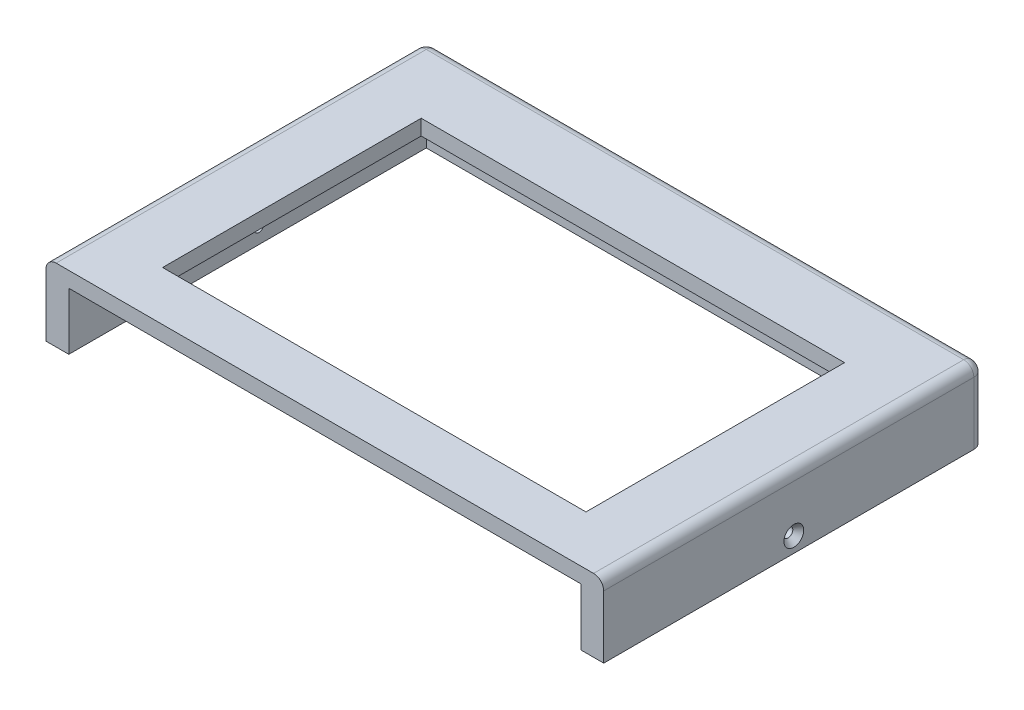
ISO-10303-21;
HEADER;
FILE_DESCRIPTION(('STEP AP214'),'2;1');
FILE_NAME('part.step','',(''),(''),'','','');
FILE_SCHEMA(('AUTOMOTIVE_DESIGN { 1 0 10303 214 1 1 1 1 }'));
ENDSEC;
DATA;
#1=APPLICATION_CONTEXT('core data for automotive mechanical design processes');
#2=APPLICATION_PROTOCOL_DEFINITION('international standard','automotive_design',2000,#1);
#3=PRODUCT_CONTEXT('',#1,'mechanical');
#4=PRODUCT('Part','Part','',(#3));
#5=PRODUCT_RELATED_PRODUCT_CATEGORY('part','',(#4));
#6=PRODUCT_DEFINITION_FORMATION('','',#4);
#7=PRODUCT_DEFINITION_CONTEXT('part definition',#1,'design');
#8=PRODUCT_DEFINITION('design','',#6,#7);
#9=PRODUCT_DEFINITION_SHAPE('','',#8);
#10=(LENGTH_UNIT() NAMED_UNIT(*) SI_UNIT(.MILLI.,.METRE.));
#11=(NAMED_UNIT(*) PLANE_ANGLE_UNIT() SI_UNIT($,.RADIAN.));
#12=(NAMED_UNIT(*) SI_UNIT($,.STERADIAN.) SOLID_ANGLE_UNIT());
#13=UNCERTAINTY_MEASURE_WITH_UNIT(LENGTH_MEASURE(1.E-05),#10,'distance_accuracy_value','');
#14=(GEOMETRIC_REPRESENTATION_CONTEXT(3) GLOBAL_UNCERTAINTY_ASSIGNED_CONTEXT((#13)) GLOBAL_UNIT_ASSIGNED_CONTEXT((#10,
#11,#12)) REPRESENTATION_CONTEXT('',''));
#15=CARTESIAN_POINT('',(0.,0.,0.));
#16=DIRECTION('',(0.,0.,1.));
#17=DIRECTION('',(1.,0.,0.));
#18=AXIS2_PLACEMENT_3D('',#15,#16,#17);
#19=CARTESIAN_POINT('',(220.,22.59,0.));
#20=DIRECTION('',(-1.,0.,0.));
#21=DIRECTION('',(0.,0.,1.));
#22=AXIS2_PLACEMENT_3D('',#19,#20,#21);
#23=PLANE('',#22);
#24=DIRECTION('',(0.,0.,-1.));
#25=VECTOR('',#24,1.);
#26=CARTESIAN_POINT('',(220.,0.,0.));
#27=LINE('',#26,#25);
#28=CARTESIAN_POINT('',(220.,0.,0.));
#29=VERTEX_POINT('',#28);
#30=CARTESIAN_POINT('',(220.,0.,-146.));
#31=VERTEX_POINT('',#30);
#32=EDGE_CURVE('E246',#29,#31,#27,.T.);
#33=ORIENTED_EDGE('',*,*,#32,.T.);
#34=DIRECTION('',(0.,-1.,0.));
#35=VECTOR('',#34,1.);
#36=CARTESIAN_POINT('',(220.,22.59,-146.));
#37=LINE('',#36,#35);
#38=CARTESIAN_POINT('',(220.,24.67,-146.));
#39=VERTEX_POINT('',#38);
#40=EDGE_CURVE('E11',#31,#39,#37,.F.);
#41=ORIENTED_EDGE('',*,*,#40,.T.);
#42=DIRECTION('',(0.,0.,-1.));
#43=VECTOR('',#42,1.);
#44=CARTESIAN_POINT('',(220.,24.67,0.));
#45=LINE('',#44,#43);
#46=CARTESIAN_POINT('',(220.,24.67,0.));
#47=VERTEX_POINT('',#46);
#48=EDGE_CURVE('E49',#39,#47,#45,.F.);
#49=ORIENTED_EDGE('',*,*,#48,.T.);
#50=DIRECTION('',(0.,-1.,0.));
#51=VECTOR('',#50,1.);
#52=CARTESIAN_POINT('',(220.,22.59,0.));
#53=LINE('',#52,#51);
#54=EDGE_CURVE('E258',#47,#29,#53,.T.);
#55=ORIENTED_EDGE('',*,*,#54,.T.);
#56=EDGE_LOOP('',(#33,#41,#49,#55));
#57=FACE_BOUND('',#56,.T.);
#58=CARTESIAN_POINT('',(220.,6.,-75.));
#59=DIRECTION('',(1.,0.,0.));
#60=DIRECTION('',(0.,0.,-1.));
#61=AXIS2_PLACEMENT_3D('',#58,#59,#60);
#62=CIRCLE('',#61,3.8989);
#63=CARTESIAN_POINT('',(220.,6.,-78.8989));
#64=VERTEX_POINT('',#63);
#65=EDGE_CURVE('E367',#64,#64,#62,.T.);
#66=ORIENTED_EDGE('',*,*,#65,.F.);
#67=EDGE_LOOP('',(#66));
#68=FACE_BOUND('',#67,.T.);
#69=ADVANCED_FACE('F39',(#57,#68),#23,.F.);
#70=CARTESIAN_POINT('',(9.00000000000001,22.59,0.));
#71=DIRECTION('',(-1.,0.,0.));
#72=DIRECTION('',(0.,0.,1.));
#73=AXIS2_PLACEMENT_3D('',#70,#71,#72);
#74=PLANE('',#73);
#75=CARTESIAN_POINT('',(9.00000000000001,6.,-75.));
#76=DIRECTION('',(-1.,0.,0.));
#77=DIRECTION('',(0.,0.,1.));
#78=AXIS2_PLACEMENT_3D('',#75,#76,#77);
#79=CIRCLE('',#78,1.89864999999999);
#80=CARTESIAN_POINT('',(9.00000000000001,6.,-73.10135));
#81=VERTEX_POINT('',#80);
#82=EDGE_CURVE('E349',#81,#81,#79,.T.);
#83=ORIENTED_EDGE('',*,*,#82,.T.);
#84=EDGE_LOOP('',(#83));
#85=FACE_BOUND('',#84,.T.);
#86=DIRECTION('',(0.,0.,-1.));
#87=VECTOR('',#86,1.);
#88=CARTESIAN_POINT('',(9.00000000000001,0.,0.));
#89=LINE('',#88,#87);
#90=CARTESIAN_POINT('',(9.00000000000001,0.,0.));
#91=VERTEX_POINT('',#90);
#92=CARTESIAN_POINT('',(9.00000000000001,0.,-141.));
#93=VERTEX_POINT('',#92);
#94=EDGE_CURVE('E233',#91,#93,#89,.T.);
#95=ORIENTED_EDGE('',*,*,#94,.T.);
#96=DIRECTION('',(0.,-1.,0.));
#97=VECTOR('',#96,1.);
#98=CARTESIAN_POINT('',(9.00000000000001,22.59,-141.));
#99=LINE('',#98,#97);
#100=CARTESIAN_POINT('',(9.00000000000001,22.59,-141.));
#101=VERTEX_POINT('',#100);
#102=EDGE_CURVE('E269',#101,#93,#99,.T.);
#103=ORIENTED_EDGE('',*,*,#102,.F.);
#104=DIRECTION('',(0.,0.,-1.));
#105=VECTOR('',#104,1.);
#106=CARTESIAN_POINT('',(9.00000000000001,22.59,0.));
#107=LINE('',#106,#105);
#108=CARTESIAN_POINT('',(9.00000000000001,22.59,0.));
#109=VERTEX_POINT('',#108);
#110=EDGE_CURVE('E216',#109,#101,#107,.T.);
#111=ORIENTED_EDGE('',*,*,#110,.F.);
#112=DIRECTION('',(0.,-1.,0.));
#113=VECTOR('',#112,1.);
#114=CARTESIAN_POINT('',(9.00000000000001,22.59,0.));
#115=LINE('',#114,#113);
#116=EDGE_CURVE('E273',#109,#91,#115,.T.);
#117=ORIENTED_EDGE('',*,*,#116,.T.);
#118=EDGE_LOOP('',(#95,#103,#111,#117));
#119=FACE_BOUND('',#118,.T.);
#120=ADVANCED_FACE('F396',(#85,#119),#74,.F.);
#121=CARTESIAN_POINT('',(9.00000000000001,22.59,-141.));
#122=DIRECTION('',(0.,0.,-1.));
#123=DIRECTION('',(-1.,0.,0.));
#124=AXIS2_PLACEMENT_3D('',#121,#122,#123);
#125=PLANE('',#124);
#126=CARTESIAN_POINT('',(110.,6.00000000000001,-141.));
#127=DIRECTION('',(0.,0.,-1.));
#128=DIRECTION('',(-1.,0.,0.));
#129=AXIS2_PLACEMENT_3D('',#126,#127,#128);
#130=CIRCLE('',#129,1.89864999999999);
#131=CARTESIAN_POINT('',(108.10135,6.00000000000001,-141.));
#132=VERTEX_POINT('',#131);
#133=EDGE_CURVE('E363',#132,#132,#130,.T.);
#134=ORIENTED_EDGE('',*,*,#133,.T.);
#135=EDGE_LOOP('',(#134));
#136=FACE_BOUND('',#135,.T.);
#137=DIRECTION('',(1.,0.,0.));
#138=VECTOR('',#137,1.);
#139=CARTESIAN_POINT('',(9.00000000000001,0.,-141.));
#140=LINE('',#139,#138);
#141=CARTESIAN_POINT('',(211.,0.,-141.));
#142=VERTEX_POINT('',#141);
#143=EDGE_CURVE('E236',#93,#142,#140,.T.);
#144=ORIENTED_EDGE('',*,*,#143,.T.);
#145=DIRECTION('',(0.,-1.,0.));
#146=VECTOR('',#145,1.);
#147=CARTESIAN_POINT('',(211.,22.59,-141.));
#148=LINE('',#147,#146);
#149=CARTESIAN_POINT('',(211.,22.59,-141.));
#150=VERTEX_POINT('',#149);
#151=EDGE_CURVE('E265',#150,#142,#148,.T.);
#152=ORIENTED_EDGE('',*,*,#151,.F.);
#153=DIRECTION('',(1.,0.,0.));
#154=VECTOR('',#153,1.);
#155=CARTESIAN_POINT('',(9.00000000000001,22.59,-141.));
#156=LINE('',#155,#154);
#157=EDGE_CURVE('E220',#101,#150,#156,.T.);
#158=ORIENTED_EDGE('',*,*,#157,.F.);
#159=ORIENTED_EDGE('',*,*,#102,.T.);
#160=EDGE_LOOP('',(#144,#152,#158,#159));
#161=FACE_BOUND('',#160,.T.);
#162=ADVANCED_FACE('F401',(#136,#161),#125,.F.);
#163=CARTESIAN_POINT('',(211.,22.59,0.));
#164=DIRECTION('',(1.,0.,0.));
#165=DIRECTION('',(0.,0.,-1.));
#166=AXIS2_PLACEMENT_3D('',#163,#164,#165);
#167=PLANE('',#166);
#168=CARTESIAN_POINT('',(211.,6.,-75.));
#169=DIRECTION('',(1.,0.,0.));
#170=DIRECTION('',(0.,0.,-1.));
#171=AXIS2_PLACEMENT_3D('',#168,#169,#170);
#172=CIRCLE('',#171,1.89865);
#173=CARTESIAN_POINT('',(211.,6.,-76.89865));
#174=VERTEX_POINT('',#173);
#175=EDGE_CURVE('E191',#174,#174,#172,.T.);
#176=ORIENTED_EDGE('',*,*,#175,.T.);
#177=EDGE_LOOP('',(#176));
#178=FACE_BOUND('',#177,.T.);
#179=DIRECTION('',(0.,0.,1.));
#180=VECTOR('',#179,1.);
#181=CARTESIAN_POINT('',(211.,0.,0.));
#182=LINE('',#181,#180);
#183=CARTESIAN_POINT('',(211.,0.,0.));
#184=VERTEX_POINT('',#183);
#185=EDGE_CURVE('E239',#142,#184,#182,.T.);
#186=ORIENTED_EDGE('',*,*,#185,.T.);
#187=DIRECTION('',(0.,-1.,0.));
#188=VECTOR('',#187,1.);
#189=CARTESIAN_POINT('',(211.,22.59,0.));
#190=LINE('',#189,#188);
#191=CARTESIAN_POINT('',(211.,22.59,0.));
#192=VERTEX_POINT('',#191);
#193=EDGE_CURVE('E261',#192,#184,#190,.T.);
#194=ORIENTED_EDGE('',*,*,#193,.F.);
#195=DIRECTION('',(0.,0.,1.));
#196=VECTOR('',#195,1.);
#197=CARTESIAN_POINT('',(211.,22.59,0.));
#198=LINE('',#197,#196);
#199=EDGE_CURVE('E225',#150,#192,#198,.T.);
#200=ORIENTED_EDGE('',*,*,#199,.F.);
#201=ORIENTED_EDGE('',*,*,#151,.T.);
#202=EDGE_LOOP('',(#186,#194,#200,#201));
#203=FACE_BOUND('',#202,.T.);
#204=ADVANCED_FACE('F378',(#178,#203),#167,.F.);
#205=CARTESIAN_POINT('',(211.,22.59,0.));
#206=DIRECTION('',(0.,0.,-1.));
#207=DIRECTION('',(-1.,0.,0.));
#208=AXIS2_PLACEMENT_3D('',#205,#206,#207);
#209=PLANE('',#208);
#210=DIRECTION('',(1.,0.,0.));
#211=VECTOR('',#210,1.);
#212=CARTESIAN_POINT('',(0.,28.67,0.));
#213=LINE('',#212,#211);
#214=CARTESIAN_POINT('',(4.,28.67,0.));
#215=VERTEX_POINT('',#214);
#216=CARTESIAN_POINT('',(216.,28.67,0.));
#217=VERTEX_POINT('',#216);
#218=EDGE_CURVE('E208',#215,#217,#213,.T.);
#219=ORIENTED_EDGE('',*,*,#218,.F.);
#220=CARTESIAN_POINT('',(4.,24.67,0.));
#221=DIRECTION('',(0.,0.,-1.));
#222=DIRECTION('',(-1.,0.,0.));
#223=AXIS2_PLACEMENT_3D('',#220,#221,#222);
#224=CIRCLE('',#223,4.);
#225=CARTESIAN_POINT('',(0.,24.67,0.));
#226=VERTEX_POINT('',#225);
#227=EDGE_CURVE('E311',#215,#226,#224,.F.);
#228=ORIENTED_EDGE('',*,*,#227,.T.);
#229=DIRECTION('',(0.,-1.,0.));
#230=VECTOR('',#229,1.);
#231=CARTESIAN_POINT('',(0.,22.59,0.));
#232=LINE('',#231,#230);
#233=CARTESIAN_POINT('',(0.,0.,0.));
#234=VERTEX_POINT('',#233);
#235=EDGE_CURVE('E229',#226,#234,#232,.T.);
#236=ORIENTED_EDGE('',*,*,#235,.T.);
#237=DIRECTION('',(1.,0.,0.));
#238=VECTOR('',#237,1.);
#239=CARTESIAN_POINT('',(0.,0.,0.));
#240=LINE('',#239,#238);
#241=EDGE_CURVE('E212',#234,#91,#240,.T.);
#242=ORIENTED_EDGE('',*,*,#241,.T.);
#243=ORIENTED_EDGE('',*,*,#116,.F.);
#244=DIRECTION('',(1.,0.,0.));
#245=VECTOR('',#244,1.);
#246=CARTESIAN_POINT('',(0.,22.59,0.));
#247=LINE('',#246,#245);
#248=EDGE_CURVE('E172',#109,#192,#247,.T.);
#249=ORIENTED_EDGE('',*,*,#248,.T.);
#250=ORIENTED_EDGE('',*,*,#193,.T.);
#251=DIRECTION('',(1.,0.,0.));
#252=VECTOR('',#251,1.);
#253=CARTESIAN_POINT('',(211.,0.,0.));
#254=LINE('',#253,#252);
#255=EDGE_CURVE('E242',#184,#29,#254,.T.);
#256=ORIENTED_EDGE('',*,*,#255,.T.);
#257=ORIENTED_EDGE('',*,*,#54,.F.);
#258=CARTESIAN_POINT('',(216.,24.67,0.));
#259=DIRECTION('',(0.,0.,-1.));
#260=DIRECTION('',(-1.,0.,0.));
#261=AXIS2_PLACEMENT_3D('',#258,#259,#260);
#262=CIRCLE('',#261,4.);
#263=EDGE_CURVE('E308',#47,#217,#262,.F.);
#264=ORIENTED_EDGE('',*,*,#263,.T.);
#265=EDGE_LOOP('',(#219,#228,#236,#242,#243,#249,#250,#256,#257,#264));
#266=FACE_BOUND('',#265,.T.);
#267=ADVANCED_FACE('F408',(#266),#209,.F.);
#268=CARTESIAN_POINT('',(220.,22.59,-150.));
#269=DIRECTION('',(0.,0.,1.));
#270=DIRECTION('',(1.,0.,0.));
#271=AXIS2_PLACEMENT_3D('',#268,#269,#270);
#272=PLANE('',#271);
#273=DIRECTION('',(-1.,0.,0.));
#274=VECTOR('',#273,1.);
#275=CARTESIAN_POINT('',(220.,0.,-150.));
#276=LINE('',#275,#274);
#277=CARTESIAN_POINT('',(216.,0.,-150.));
#278=VERTEX_POINT('',#277);
#279=CARTESIAN_POINT('',(4.,0.,-150.));
#280=VERTEX_POINT('',#279);
#281=EDGE_CURVE('E249',#278,#280,#276,.T.);
#282=ORIENTED_EDGE('',*,*,#281,.T.);
#283=DIRECTION('',(0.,-1.,0.));
#284=VECTOR('',#283,1.);
#285=CARTESIAN_POINT('',(4.,22.59,-150.));
#286=LINE('',#285,#284);
#287=CARTESIAN_POINT('',(4.,24.67,-150.));
#288=VERTEX_POINT('',#287);
#289=EDGE_CURVE('E296',#280,#288,#286,.F.);
#290=ORIENTED_EDGE('',*,*,#289,.T.);
#291=DIRECTION('',(-1.,0.,0.));
#292=VECTOR('',#291,1.);
#293=CARTESIAN_POINT('',(220.,24.67,-150.));
#294=LINE('',#293,#292);
#295=CARTESIAN_POINT('',(216.,24.67,-150.));
#296=VERTEX_POINT('',#295);
#297=EDGE_CURVE('E290',#288,#296,#294,.F.);
#298=ORIENTED_EDGE('',*,*,#297,.T.);
#299=DIRECTION('',(0.,-1.,0.));
#300=VECTOR('',#299,1.);
#301=CARTESIAN_POINT('',(216.,22.59,-150.));
#302=LINE('',#301,#300);
#303=EDGE_CURVE('E293',#296,#278,#302,.T.);
#304=ORIENTED_EDGE('',*,*,#303,.T.);
#305=EDGE_LOOP('',(#282,#290,#298,#304));
#306=FACE_BOUND('',#305,.T.);
#307=CARTESIAN_POINT('',(110.,6.00000000000001,-150.));
#308=DIRECTION('',(0.,0.,-1.));
#309=DIRECTION('',(-1.,0.,0.));
#310=AXIS2_PLACEMENT_3D('',#307,#308,#309);
#311=CIRCLE('',#310,3.8989);
#312=CARTESIAN_POINT('',(106.1011,6.00000000000001,-150.));
#313=VERTEX_POINT('',#312);
#314=EDGE_CURVE('E355',#313,#313,#311,.T.);
#315=ORIENTED_EDGE('',*,*,#314,.F.);
#316=EDGE_LOOP('',(#315));
#317=FACE_BOUND('',#316,.T.);
#318=ADVANCED_FACE('F406',(#306,#317),#272,.F.);
#319=CARTESIAN_POINT('',(0.,22.59,-150.));
#320=DIRECTION('',(1.,0.,0.));
#321=DIRECTION('',(0.,0.,-1.));
#322=AXIS2_PLACEMENT_3D('',#319,#320,#321);
#323=PLANE('',#322);
#324=CARTESIAN_POINT('',(0.,6.,-75.));
#325=DIRECTION('',(-1.,0.,0.));
#326=DIRECTION('',(0.,0.,1.));
#327=AXIS2_PLACEMENT_3D('',#324,#325,#326);
#328=CIRCLE('',#327,3.8989);
#329=CARTESIAN_POINT('',(0.,6.,-71.1011));
#330=VERTEX_POINT('',#329);
#331=EDGE_CURVE('E339',#330,#330,#328,.T.);
#332=ORIENTED_EDGE('',*,*,#331,.F.);
#333=EDGE_LOOP('',(#332));
#334=FACE_BOUND('',#333,.T.);
#335=DIRECTION('',(0.,0.,1.));
#336=VECTOR('',#335,1.);
#337=CARTESIAN_POINT('',(0.,24.67,-150.));
#338=LINE('',#337,#336);
#339=CARTESIAN_POINT('',(0.,24.67,-146.));
#340=VERTEX_POINT('',#339);
#341=EDGE_CURVE('E277',#226,#340,#338,.F.);
#342=ORIENTED_EDGE('',*,*,#341,.T.);
#343=DIRECTION('',(0.,-1.,0.));
#344=VECTOR('',#343,1.);
#345=CARTESIAN_POINT('',(0.,22.59,-146.));
#346=LINE('',#345,#344);
#347=CARTESIAN_POINT('',(0.,0.,-146.));
#348=VERTEX_POINT('',#347);
#349=EDGE_CURVE('E280',#340,#348,#346,.T.);
#350=ORIENTED_EDGE('',*,*,#349,.T.);
#351=DIRECTION('',(0.,0.,1.));
#352=VECTOR('',#351,1.);
#353=CARTESIAN_POINT('',(0.,0.,-150.));
#354=LINE('',#353,#352);
#355=EDGE_CURVE('E221',#348,#234,#354,.T.);
#356=ORIENTED_EDGE('',*,*,#355,.T.);
#357=ORIENTED_EDGE('',*,*,#235,.F.);
#358=EDGE_LOOP('',(#342,#350,#356,#357));
#359=FACE_BOUND('',#358,.T.);
#360=ADVANCED_FACE('F459',(#334,#359),#323,.F.);
#361=CARTESIAN_POINT('',(0.,0.,0.));
#362=DIRECTION('',(0.,1.,0.));
#363=DIRECTION('',(0.,0.,1.));
#364=AXIS2_PLACEMENT_3D('',#361,#362,#363);
#365=PLANE('',#364);
#366=ORIENTED_EDGE('',*,*,#355,.F.);
#367=CARTESIAN_POINT('',(4.,0.,-146.));
#368=DIRECTION('',(0.,1.,0.));
#369=DIRECTION('',(0.,0.,1.));
#370=AXIS2_PLACEMENT_3D('',#367,#368,#369);
#371=CIRCLE('',#370,4.);
#372=EDGE_CURVE('E287',#348,#280,#371,.F.);
#373=ORIENTED_EDGE('',*,*,#372,.T.);
#374=ORIENTED_EDGE('',*,*,#281,.F.);
#375=CARTESIAN_POINT('',(216.,0.,-146.));
#376=DIRECTION('',(0.,1.,0.));
#377=DIRECTION('',(0.,0.,1.));
#378=AXIS2_PLACEMENT_3D('',#375,#376,#377);
#379=CIRCLE('',#378,4.);
#380=EDGE_CURVE('E284',#278,#31,#379,.F.);
#381=ORIENTED_EDGE('',*,*,#380,.T.);
#382=ORIENTED_EDGE('',*,*,#32,.F.);
#383=ORIENTED_EDGE('',*,*,#255,.F.);
#384=ORIENTED_EDGE('',*,*,#185,.F.);
#385=ORIENTED_EDGE('',*,*,#143,.F.);
#386=ORIENTED_EDGE('',*,*,#94,.F.);
#387=ORIENTED_EDGE('',*,*,#241,.F.);
#388=EDGE_LOOP('',(#366,#373,#374,#381,#382,#383,#384,#385,#386,#387));
#389=FACE_BOUND('',#388,.T.);
#390=ADVANCED_FACE('F463',(#389),#365,.F.);
#391=CARTESIAN_POINT('',(0.,22.59,0.));
#392=DIRECTION('',(0.,1.,0.));
#393=DIRECTION('',(0.,0.,1.));
#394=AXIS2_PLACEMENT_3D('',#391,#392,#393);
#395=PLANE('',#394);
#396=DIRECTION('',(0.,0.,1.));
#397=VECTOR('',#396,1.);
#398=CARTESIAN_POINT('',(26.5,22.59,-121.5));
#399=LINE('',#398,#397);
#400=CARTESIAN_POINT('',(26.5,22.59,-121.5));
#401=VERTEX_POINT('',#400);
#402=CARTESIAN_POINT('',(26.5,22.59,-19.5));
#403=VERTEX_POINT('',#402);
#404=EDGE_CURVE('E188',#401,#403,#399,.T.);
#405=ORIENTED_EDGE('',*,*,#404,.T.);
#406=DIRECTION('',(1.,0.,0.));
#407=VECTOR('',#406,1.);
#408=CARTESIAN_POINT('',(26.5,22.59,-19.5));
#409=LINE('',#408,#407);
#410=CARTESIAN_POINT('',(193.5,22.59,-19.5));
#411=VERTEX_POINT('',#410);
#412=EDGE_CURVE('E170',#403,#411,#409,.T.);
#413=ORIENTED_EDGE('',*,*,#412,.T.);
#414=DIRECTION('',(0.,0.,-1.));
#415=VECTOR('',#414,1.);
#416=CARTESIAN_POINT('',(193.5,22.59,-121.5));
#417=LINE('',#416,#415);
#418=CARTESIAN_POINT('',(193.5,22.59,-121.5));
#419=VERTEX_POINT('',#418);
#420=EDGE_CURVE('E194',#411,#419,#417,.T.);
#421=ORIENTED_EDGE('',*,*,#420,.T.);
#422=DIRECTION('',(-1.,0.,0.));
#423=VECTOR('',#422,1.);
#424=CARTESIAN_POINT('',(26.5,22.59,-121.5));
#425=LINE('',#424,#423);
#426=EDGE_CURVE('E164',#419,#401,#425,.T.);
#427=ORIENTED_EDGE('',*,*,#426,.T.);
#428=EDGE_LOOP('',(#405,#413,#421,#427));
#429=FACE_BOUND('',#428,.T.);
#430=ORIENTED_EDGE('',*,*,#248,.F.);
#431=ORIENTED_EDGE('',*,*,#110,.T.);
#432=ORIENTED_EDGE('',*,*,#157,.T.);
#433=ORIENTED_EDGE('',*,*,#199,.T.);
#434=EDGE_LOOP('',(#430,#431,#432,#433));
#435=FACE_BOUND('',#434,.T.);
#436=ADVANCED_FACE('F470',(#429,#435),#395,.F.);
#437=CARTESIAN_POINT('',(0.,28.67,0.));
#438=DIRECTION('',(0.,1.,0.));
#439=DIRECTION('',(0.,0.,1.));
#440=AXIS2_PLACEMENT_3D('',#437,#438,#439);
#441=PLANE('',#440);
#442=DIRECTION('',(-1.,0.,0.));
#443=VECTOR('',#442,1.);
#444=CARTESIAN_POINT('',(0.,28.67,-146.));
#445=LINE('',#444,#443);
#446=CARTESIAN_POINT('',(216.,28.67,-146.));
#447=VERTEX_POINT('',#446);
#448=CARTESIAN_POINT('',(4.,28.67,-146.));
#449=VERTEX_POINT('',#448);
#450=EDGE_CURVE('E302',#447,#449,#445,.T.);
#451=ORIENTED_EDGE('',*,*,#450,.T.);
#452=DIRECTION('',(0.,0.,1.));
#453=VECTOR('',#452,1.);
#454=CARTESIAN_POINT('',(4.,28.67,0.));
#455=LINE('',#454,#453);
#456=EDGE_CURVE('E305',#449,#215,#455,.T.);
#457=ORIENTED_EDGE('',*,*,#456,.T.);
#458=ORIENTED_EDGE('',*,*,#218,.T.);
#459=DIRECTION('',(0.,0.,-1.));
#460=VECTOR('',#459,1.);
#461=CARTESIAN_POINT('',(216.,28.67,-150.));
#462=LINE('',#461,#460);
#463=EDGE_CURVE('E299',#217,#447,#462,.T.);
#464=ORIENTED_EDGE('',*,*,#463,.T.);
#465=EDGE_LOOP('',(#451,#457,#458,#464));
#466=FACE_BOUND('',#465,.T.);
#467=DIRECTION('',(1.,0.,0.));
#468=VECTOR('',#467,1.);
#469=CARTESIAN_POINT('',(26.5,28.67,-19.5));
#470=LINE('',#469,#468);
#471=CARTESIAN_POINT('',(26.5,28.67,-19.5));
#472=VERTEX_POINT('',#471);
#473=CARTESIAN_POINT('',(193.5,28.67,-19.5));
#474=VERTEX_POINT('',#473);
#475=EDGE_CURVE('E163',#472,#474,#470,.T.);
#476=ORIENTED_EDGE('',*,*,#475,.F.);
#477=DIRECTION('',(0.,0.,1.));
#478=VECTOR('',#477,1.);
#479=CARTESIAN_POINT('',(26.5,28.67,-121.5));
#480=LINE('',#479,#478);
#481=CARTESIAN_POINT('',(26.5,28.67,-121.5));
#482=VERTEX_POINT('',#481);
#483=EDGE_CURVE('E152',#482,#472,#480,.T.);
#484=ORIENTED_EDGE('',*,*,#483,.F.);
#485=DIRECTION('',(-1.,0.,0.));
#486=VECTOR('',#485,1.);
#487=CARTESIAN_POINT('',(26.5,28.67,-121.5));
#488=LINE('',#487,#486);
#489=CARTESIAN_POINT('',(193.5,28.67,-121.5));
#490=VERTEX_POINT('',#489);
#491=EDGE_CURVE('E182',#490,#482,#488,.T.);
#492=ORIENTED_EDGE('',*,*,#491,.F.);
#493=DIRECTION('',(0.,0.,-1.));
#494=VECTOR('',#493,1.);
#495=CARTESIAN_POINT('',(193.5,28.67,-121.5));
#496=LINE('',#495,#494);
#497=EDGE_CURVE('E178',#474,#490,#496,.T.);
#498=ORIENTED_EDGE('',*,*,#497,.F.);
#499=EDGE_LOOP('',(#476,#484,#492,#498));
#500=FACE_BOUND('',#499,.T.);
#501=ADVANCED_FACE('F176',(#466,#500),#441,.T.);
#502=CARTESIAN_POINT('',(26.5,28.67,-121.5));
#503=DIRECTION('',(1.,0.,0.));
#504=DIRECTION('',(0.,0.,-1.));
#505=AXIS2_PLACEMENT_3D('',#502,#503,#504);
#506=PLANE('',#505);
#507=ORIENTED_EDGE('',*,*,#404,.F.);
#508=DIRECTION('',(0.,-1.,0.));
#509=VECTOR('',#508,1.);
#510=CARTESIAN_POINT('',(26.5,28.67,-121.5));
#511=LINE('',#510,#509);
#512=EDGE_CURVE('E158',#482,#401,#511,.T.);
#513=ORIENTED_EDGE('',*,*,#512,.F.);
#514=ORIENTED_EDGE('',*,*,#483,.T.);
#515=DIRECTION('',(0.,-1.,0.));
#516=VECTOR('',#515,1.);
#517=CARTESIAN_POINT('',(26.5,28.67,-19.5));
#518=LINE('',#517,#516);
#519=EDGE_CURVE('E155',#472,#403,#518,.T.);
#520=ORIENTED_EDGE('',*,*,#519,.T.);
#521=EDGE_LOOP('',(#507,#513,#514,#520));
#522=FACE_BOUND('',#521,.T.);
#523=ADVANCED_FACE('F154',(#522),#506,.T.);
#524=CARTESIAN_POINT('',(26.5,28.67,-19.5));
#525=DIRECTION('',(0.,0.,-1.));
#526=DIRECTION('',(-1.,0.,0.));
#527=AXIS2_PLACEMENT_3D('',#524,#525,#526);
#528=PLANE('',#527);
#529=ORIENTED_EDGE('',*,*,#412,.F.);
#530=ORIENTED_EDGE('',*,*,#519,.F.);
#531=ORIENTED_EDGE('',*,*,#475,.T.);
#532=DIRECTION('',(0.,-1.,0.));
#533=VECTOR('',#532,1.);
#534=CARTESIAN_POINT('',(193.5,28.67,-19.5));
#535=LINE('',#534,#533);
#536=EDGE_CURVE('E173',#474,#411,#535,.T.);
#537=ORIENTED_EDGE('',*,*,#536,.T.);
#538=EDGE_LOOP('',(#529,#530,#531,#537));
#539=FACE_BOUND('',#538,.T.);
#540=ADVANCED_FACE('F167',(#539),#528,.T.);
#541=CARTESIAN_POINT('',(193.5,28.67,-121.5));
#542=DIRECTION('',(-1.,0.,0.));
#543=DIRECTION('',(0.,0.,1.));
#544=AXIS2_PLACEMENT_3D('',#541,#542,#543);
#545=PLANE('',#544);
#546=ORIENTED_EDGE('',*,*,#420,.F.);
#547=ORIENTED_EDGE('',*,*,#536,.F.);
#548=ORIENTED_EDGE('',*,*,#497,.T.);
#549=DIRECTION('',(0.,-1.,0.));
#550=VECTOR('',#549,1.);
#551=CARTESIAN_POINT('',(193.5,28.67,-121.5));
#552=LINE('',#551,#550);
#553=EDGE_CURVE('E203',#490,#419,#552,.T.);
#554=ORIENTED_EDGE('',*,*,#553,.T.);
#555=EDGE_LOOP('',(#546,#547,#548,#554));
#556=FACE_BOUND('',#555,.T.);
#557=ADVANCED_FACE('F501',(#556),#545,.T.);
#558=CARTESIAN_POINT('',(26.5,28.67,-121.5));
#559=DIRECTION('',(0.,0.,1.));
#560=DIRECTION('',(1.,0.,0.));
#561=AXIS2_PLACEMENT_3D('',#558,#559,#560);
#562=PLANE('',#561);
#563=ORIENTED_EDGE('',*,*,#426,.F.);
#564=ORIENTED_EDGE('',*,*,#553,.F.);
#565=ORIENTED_EDGE('',*,*,#491,.T.);
#566=ORIENTED_EDGE('',*,*,#512,.T.);
#567=EDGE_LOOP('',(#563,#564,#565,#566));
#568=FACE_BOUND('',#567,.T.);
#569=ADVANCED_FACE('F385',(#568),#562,.T.);
#570=CARTESIAN_POINT('',(220.,6.,-75.));
#571=DIRECTION('',(1.,0.,0.));
#572=DIRECTION('',(0.,0.,-1.));
#573=AXIS2_PLACEMENT_3D('',#570,#571,#572);
#574=CYLINDRICAL_SURFACE('',#573,1.89865);
#575=ORIENTED_EDGE('',*,*,#175,.F.);
#576=EDGE_LOOP('',(#575));
#577=FACE_BOUND('',#576,.T.);
#578=CARTESIAN_POINT('',(217.698975593456,6.,-75.));
#579=DIRECTION('',(1.,0.,0.));
#580=DIRECTION('',(0.,0.,-1.));
#581=AXIS2_PLACEMENT_3D('',#578,#579,#580);
#582=CIRCLE('',#581,1.89865);
#583=CARTESIAN_POINT('',(217.698975593456,6.,-76.89865));
#584=VERTEX_POINT('',#583);
#585=EDGE_CURVE('E371',#584,#584,#582,.T.);
#586=ORIENTED_EDGE('',*,*,#585,.T.);
#587=EDGE_LOOP('',(#586));
#588=FACE_BOUND('',#587,.T.);
#589=ADVANCED_FACE('F381',(#577,#588),#574,.F.);
#590=CARTESIAN_POINT('',(220.,6.,-75.));
#591=DIRECTION('',(1.,0.,0.));
#592=DIRECTION('',(0.,0.,-1.));
#593=AXIS2_PLACEMENT_3D('',#590,#591,#592);
#594=CONICAL_SURFACE('',#593,3.8989,0.715584993317672);
#595=ORIENTED_EDGE('',*,*,#585,.F.);
#596=EDGE_LOOP('',(#595));
#597=FACE_BOUND('',#596,.T.);
#598=ORIENTED_EDGE('',*,*,#65,.T.);
#599=EDGE_LOOP('',(#598));
#600=FACE_BOUND('',#599,.T.);
#601=ADVANCED_FACE('F384',(#597,#600),#594,.F.);
#602=CARTESIAN_POINT('',(110.,6.00000000000001,-150.));
#603=DIRECTION('',(0.,0.,-1.));
#604=DIRECTION('',(-1.,0.,0.));
#605=AXIS2_PLACEMENT_3D('',#602,#603,#604);
#606=CYLINDRICAL_SURFACE('',#605,1.89864999999999);
#607=ORIENTED_EDGE('',*,*,#133,.F.);
#608=EDGE_LOOP('',(#607));
#609=FACE_BOUND('',#608,.T.);
#610=CARTESIAN_POINT('',(110.,6.00000000000001,-147.698975593456));
#611=DIRECTION('',(0.,0.,-1.));
#612=DIRECTION('',(-1.,0.,0.));
#613=AXIS2_PLACEMENT_3D('',#610,#611,#612);
#614=CIRCLE('',#613,1.89864999999999);
#615=CARTESIAN_POINT('',(108.10135,6.00000000000001,-147.698975593456));
#616=VERTEX_POINT('',#615);
#617=EDGE_CURVE('E359',#616,#616,#614,.T.);
#618=ORIENTED_EDGE('',*,*,#617,.T.);
#619=EDGE_LOOP('',(#618));
#620=FACE_BOUND('',#619,.T.);
#621=ADVANCED_FACE('F391',(#609,#620),#606,.F.);
#622=CARTESIAN_POINT('',(110.,6.00000000000001,-150.));
#623=DIRECTION('',(0.,0.,-1.));
#624=DIRECTION('',(-1.,0.,0.));
#625=AXIS2_PLACEMENT_3D('',#622,#623,#624);
#626=CONICAL_SURFACE('',#625,3.8989,0.715584993317674);
#627=ORIENTED_EDGE('',*,*,#617,.F.);
#628=EDGE_LOOP('',(#627));
#629=FACE_BOUND('',#628,.T.);
#630=ORIENTED_EDGE('',*,*,#314,.T.);
#631=EDGE_LOOP('',(#630));
#632=FACE_BOUND('',#631,.T.);
#633=ADVANCED_FACE('F483',(#629,#632),#626,.F.);
#634=CARTESIAN_POINT('',(0.,6.,-75.));
#635=DIRECTION('',(-1.,0.,0.));
#636=DIRECTION('',(0.,0.,1.));
#637=AXIS2_PLACEMENT_3D('',#634,#635,#636);
#638=CYLINDRICAL_SURFACE('',#637,1.89864999999999);
#639=ORIENTED_EDGE('',*,*,#82,.F.);
#640=EDGE_LOOP('',(#639));
#641=FACE_BOUND('',#640,.T.);
#642=CARTESIAN_POINT('',(2.30102440654384,6.,-75.));
#643=DIRECTION('',(-1.,0.,0.));
#644=DIRECTION('',(0.,0.,1.));
#645=AXIS2_PLACEMENT_3D('',#642,#643,#644);
#646=CIRCLE('',#645,1.89864999999999);
#647=CARTESIAN_POINT('',(2.30102440654384,6.,-73.10135));
#648=VERTEX_POINT('',#647);
#649=EDGE_CURVE('E343',#648,#648,#646,.T.);
#650=ORIENTED_EDGE('',*,*,#649,.T.);
#651=EDGE_LOOP('',(#650));
#652=FACE_BOUND('',#651,.T.);
#653=ADVANCED_FACE('F485',(#641,#652),#638,.F.);
#654=CARTESIAN_POINT('',(0.,6.,-75.));
#655=DIRECTION('',(-1.,0.,0.));
#656=DIRECTION('',(0.,0.,1.));
#657=AXIS2_PLACEMENT_3D('',#654,#655,#656);
#658=CONICAL_SURFACE('',#657,3.8989,0.715584993317675);
#659=ORIENTED_EDGE('',*,*,#649,.F.);
#660=EDGE_LOOP('',(#659));
#661=FACE_BOUND('',#660,.T.);
#662=ORIENTED_EDGE('',*,*,#331,.T.);
#663=EDGE_LOOP('',(#662));
#664=FACE_BOUND('',#663,.T.);
#665=ADVANCED_FACE('F441',(#661,#664),#658,.F.);
#666=CARTESIAN_POINT('',(216.,22.59,-146.));
#667=DIRECTION('',(0.,-1.,0.));
#668=DIRECTION('',(0.,0.,-1.));
#669=AXIS2_PLACEMENT_3D('',#666,#667,#668);
#670=CYLINDRICAL_SURFACE('',#669,4.);
#671=ORIENTED_EDGE('',*,*,#380,.F.);
#672=ORIENTED_EDGE('',*,*,#303,.F.);
#673=CARTESIAN_POINT('',(216.,24.67,-146.));
#674=DIRECTION('',(0.,1.,0.));
#675=DIRECTION('',(0.,0.,1.));
#676=AXIS2_PLACEMENT_3D('',#673,#674,#675);
#677=CIRCLE('',#676,4.);
#678=EDGE_CURVE('E43',#39,#296,#677,.T.);
#679=ORIENTED_EDGE('',*,*,#678,.F.);
#680=ORIENTED_EDGE('',*,*,#40,.F.);
#681=EDGE_LOOP('',(#671,#672,#679,#680));
#682=FACE_BOUND('',#681,.T.);
#683=ADVANCED_FACE('F41',(#682),#670,.T.);
#684=CARTESIAN_POINT('',(216.,24.67,0.));
#685=DIRECTION('',(0.,0.,1.));
#686=DIRECTION('',(1.,0.,0.));
#687=AXIS2_PLACEMENT_3D('',#684,#685,#686);
#688=CYLINDRICAL_SURFACE('',#687,4.);
#689=ORIENTED_EDGE('',*,*,#263,.F.);
#690=ORIENTED_EDGE('',*,*,#48,.F.);
#691=CARTESIAN_POINT('',(216.,24.67,-146.));
#692=DIRECTION('',(0.,0.,-1.));
#693=DIRECTION('',(-1.,0.,0.));
#694=AXIS2_PLACEMENT_3D('',#691,#692,#693);
#695=CIRCLE('',#694,4.);
#696=EDGE_CURVE('E331',#447,#39,#695,.T.);
#697=ORIENTED_EDGE('',*,*,#696,.F.);
#698=ORIENTED_EDGE('',*,*,#463,.F.);
#699=EDGE_LOOP('',(#689,#690,#697,#698));
#700=FACE_BOUND('',#699,.T.);
#701=ADVANCED_FACE('F435',(#700),#688,.T.);
#702=CARTESIAN_POINT('',(216.,24.67,-146.));
#703=DIRECTION('',(0.,0.,1.));
#704=DIRECTION('',(1.,0.,0.));
#705=AXIS2_PLACEMENT_3D('',#702,#703,#704);
#706=SPHERICAL_SURFACE('',#705,4.);
#707=ORIENTED_EDGE('',*,*,#696,.T.);
#708=ORIENTED_EDGE('',*,*,#678,.T.);
#709=CARTESIAN_POINT('',(216.,24.67,-146.));
#710=DIRECTION('',(1.,0.,0.));
#711=DIRECTION('',(0.,0.,-1.));
#712=AXIS2_PLACEMENT_3D('',#709,#710,#711);
#713=CIRCLE('',#712,4.);
#714=EDGE_CURVE('E328',#447,#296,#713,.F.);
#715=ORIENTED_EDGE('',*,*,#714,.F.);
#716=EDGE_LOOP('',(#707,#708,#715));
#717=FACE_BOUND('',#716,.T.);
#718=ADVANCED_FACE('F432',(#717),#706,.T.);
#719=CARTESIAN_POINT('',(0.,24.67,-146.));
#720=DIRECTION('',(1.,0.,0.));
#721=DIRECTION('',(0.,0.,-1.));
#722=AXIS2_PLACEMENT_3D('',#719,#720,#721);
#723=CYLINDRICAL_SURFACE('',#722,4.);
#724=ORIENTED_EDGE('',*,*,#714,.T.);
#725=ORIENTED_EDGE('',*,*,#297,.F.);
#726=CARTESIAN_POINT('',(4.,24.67,-146.));
#727=DIRECTION('',(-1.,0.,0.));
#728=DIRECTION('',(0.,0.,1.));
#729=AXIS2_PLACEMENT_3D('',#726,#727,#728);
#730=CIRCLE('',#729,4.);
#731=EDGE_CURVE('E324',#449,#288,#730,.T.);
#732=ORIENTED_EDGE('',*,*,#731,.F.);
#733=ORIENTED_EDGE('',*,*,#450,.F.);
#734=EDGE_LOOP('',(#724,#725,#732,#733));
#735=FACE_BOUND('',#734,.T.);
#736=ADVANCED_FACE('F428',(#735),#723,.T.);
#737=CARTESIAN_POINT('',(4.,24.67,0.));
#738=DIRECTION('',(0.,0.,-1.));
#739=DIRECTION('',(-1.,0.,0.));
#740=AXIS2_PLACEMENT_3D('',#737,#738,#739);
#741=CYLINDRICAL_SURFACE('',#740,4.);
#742=ORIENTED_EDGE('',*,*,#227,.F.);
#743=ORIENTED_EDGE('',*,*,#456,.F.);
#744=CARTESIAN_POINT('',(4.,24.67,-146.));
#745=DIRECTION('',(0.,0.,-1.));
#746=DIRECTION('',(-1.,0.,0.));
#747=AXIS2_PLACEMENT_3D('',#744,#745,#746);
#748=CIRCLE('',#747,4.);
#749=EDGE_CURVE('E320',#340,#449,#748,.T.);
#750=ORIENTED_EDGE('',*,*,#749,.F.);
#751=ORIENTED_EDGE('',*,*,#341,.F.);
#752=EDGE_LOOP('',(#742,#743,#750,#751));
#753=FACE_BOUND('',#752,.T.);
#754=ADVANCED_FACE('F424',(#753),#741,.T.);
#755=CARTESIAN_POINT('',(4.,24.67,-146.));
#756=DIRECTION('',(0.,0.,1.));
#757=DIRECTION('',(1.,0.,0.));
#758=AXIS2_PLACEMENT_3D('',#755,#756,#757);
#759=SPHERICAL_SURFACE('',#758,4.);
#760=ORIENTED_EDGE('',*,*,#749,.T.);
#761=ORIENTED_EDGE('',*,*,#731,.T.);
#762=CARTESIAN_POINT('',(4.,24.67,-146.));
#763=DIRECTION('',(0.,1.,0.));
#764=DIRECTION('',(0.,0.,1.));
#765=AXIS2_PLACEMENT_3D('',#762,#763,#764);
#766=CIRCLE('',#765,4.);
#767=EDGE_CURVE('E316',#340,#288,#766,.F.);
#768=ORIENTED_EDGE('',*,*,#767,.F.);
#769=EDGE_LOOP('',(#760,#761,#768));
#770=FACE_BOUND('',#769,.T.);
#771=ADVANCED_FACE('F420',(#770),#759,.T.);
#772=CARTESIAN_POINT('',(4.,22.59,-146.));
#773=DIRECTION('',(0.,-1.,0.));
#774=DIRECTION('',(0.,0.,-1.));
#775=AXIS2_PLACEMENT_3D('',#772,#773,#774);
#776=CYLINDRICAL_SURFACE('',#775,4.);
#777=ORIENTED_EDGE('',*,*,#767,.T.);
#778=ORIENTED_EDGE('',*,*,#289,.F.);
#779=ORIENTED_EDGE('',*,*,#372,.F.);
#780=ORIENTED_EDGE('',*,*,#349,.F.);
#781=EDGE_LOOP('',(#777,#778,#779,#780));
#782=FACE_BOUND('',#781,.T.);
#783=ADVANCED_FACE('F417',(#782),#776,.T.);
#784=CLOSED_SHELL('',(#69,#120,#162,#204,#267,#318,#360,#390,#436,#501,#523,#540,#557,#569,#589,
#601,#621,#633,#653,#665,#683,#701,#718,#736,#754,#771,#783));
#785=MANIFOLD_SOLID_BREP('B2',#784);
#786=ADVANCED_BREP_SHAPE_REPRESENTATION('',(#18,#785),#14);
#787=SHAPE_DEFINITION_REPRESENTATION(#9,#786);
ENDSEC;
END-ISO-10303-21;
